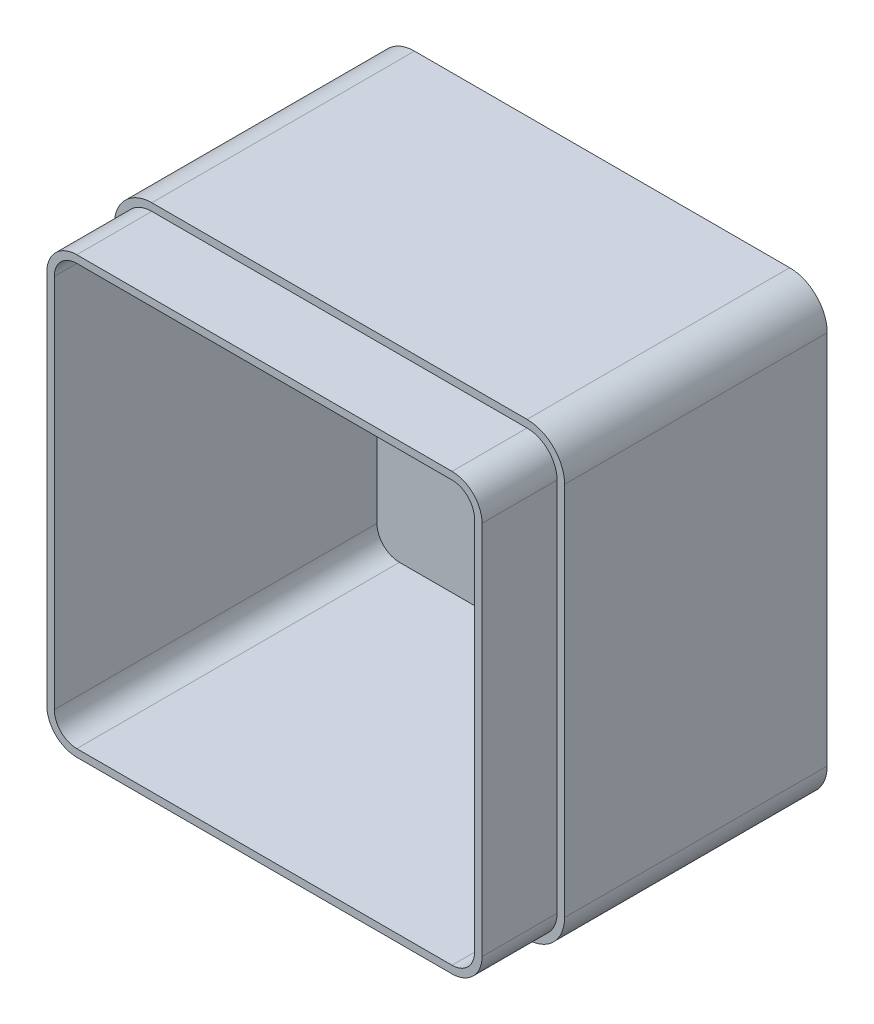
ISO-10303-21;
HEADER;
FILE_DESCRIPTION(('STEP AP214'),'2;1');
FILE_NAME('part.step','',(''),(''),'','','');
FILE_SCHEMA(('AUTOMOTIVE_DESIGN { 1 0 10303 214 1 1 1 1 }'));
ENDSEC;
DATA;
#1=APPLICATION_CONTEXT('core data for automotive mechanical design processes');
#2=APPLICATION_PROTOCOL_DEFINITION('international standard','automotive_design',2000,#1);
#3=PRODUCT_CONTEXT('',#1,'mechanical');
#4=PRODUCT('Part','Part','',(#3));
#5=PRODUCT_RELATED_PRODUCT_CATEGORY('part','',(#4));
#6=PRODUCT_DEFINITION_FORMATION('','',#4);
#7=PRODUCT_DEFINITION_CONTEXT('part definition',#1,'design');
#8=PRODUCT_DEFINITION('design','',#6,#7);
#9=PRODUCT_DEFINITION_SHAPE('','',#8);
#10=(LENGTH_UNIT() NAMED_UNIT(*) SI_UNIT(.MILLI.,.METRE.));
#11=(NAMED_UNIT(*) PLANE_ANGLE_UNIT() SI_UNIT($,.RADIAN.));
#12=(NAMED_UNIT(*) SI_UNIT($,.STERADIAN.) SOLID_ANGLE_UNIT());
#13=UNCERTAINTY_MEASURE_WITH_UNIT(LENGTH_MEASURE(1.E-05),#10,'distance_accuracy_value','');
#14=(GEOMETRIC_REPRESENTATION_CONTEXT(3) GLOBAL_UNCERTAINTY_ASSIGNED_CONTEXT((#13)) GLOBAL_UNIT_ASSIGNED_CONTEXT((#10,
#11,#12)) REPRESENTATION_CONTEXT('',''));
#15=CARTESIAN_POINT('',(0.,0.,0.));
#16=DIRECTION('',(0.,0.,1.));
#17=DIRECTION('',(1.,0.,0.));
#18=AXIS2_PLACEMENT_3D('',#15,#16,#17);
#19=CARTESIAN_POINT('',(0.,0.,90.));
#20=DIRECTION('',(0.,0.,-1.));
#21=DIRECTION('',(-1.,0.,0.));
#22=AXIS2_PLACEMENT_3D('',#19,#20,#21);
#23=PLANE('',#22);
#24=DIRECTION('',(0.,1.,0.));
#25=VECTOR('',#24,1.);
#26=CARTESIAN_POINT('',(116.,0.,90.));
#27=LINE('',#26,#25);
#28=CARTESIAN_POINT('',(116.,9.99999999999999,90.));
#29=VERTEX_POINT('',#28);
#30=CARTESIAN_POINT('',(116.,110.,90.));
#31=VERTEX_POINT('',#30);
#32=EDGE_CURVE('E334',#29,#31,#27,.T.);
#33=ORIENTED_EDGE('',*,*,#32,.F.);
#34=CARTESIAN_POINT('',(110.,10.,90.));
#35=DIRECTION('',(0.,0.,-1.));
#36=DIRECTION('',(-1.,0.,0.));
#37=AXIS2_PLACEMENT_3D('',#34,#35,#36);
#38=CIRCLE('',#37,6.);
#39=CARTESIAN_POINT('',(110.,4.,90.));
#40=VERTEX_POINT('',#39);
#41=EDGE_CURVE('E332',#40,#29,#38,.F.);
#42=ORIENTED_EDGE('',*,*,#41,.F.);
#43=DIRECTION('',(1.,0.,0.));
#44=VECTOR('',#43,1.);
#45=CARTESIAN_POINT('',(0.,4.,90.));
#46=LINE('',#45,#44);
#47=CARTESIAN_POINT('',(9.99999999999999,4.,90.));
#48=VERTEX_POINT('',#47);
#49=EDGE_CURVE('E330',#48,#40,#46,.T.);
#50=ORIENTED_EDGE('',*,*,#49,.F.);
#51=CARTESIAN_POINT('',(10.,10.,90.));
#52=DIRECTION('',(0.,0.,-1.));
#53=DIRECTION('',(-1.,0.,0.));
#54=AXIS2_PLACEMENT_3D('',#51,#52,#53);
#55=CIRCLE('',#54,6.);
#56=CARTESIAN_POINT('',(4.,9.99999999999999,90.));
#57=VERTEX_POINT('',#56);
#58=EDGE_CURVE('E322',#57,#48,#55,.F.);
#59=ORIENTED_EDGE('',*,*,#58,.F.);
#60=DIRECTION('',(0.,-1.,0.));
#61=VECTOR('',#60,1.);
#62=CARTESIAN_POINT('',(4.,0.,90.));
#63=LINE('',#62,#61);
#64=CARTESIAN_POINT('',(4.,110.,90.));
#65=VERTEX_POINT('',#64);
#66=EDGE_CURVE('E296',#65,#57,#63,.T.);
#67=ORIENTED_EDGE('',*,*,#66,.F.);
#68=CARTESIAN_POINT('',(10.,110.,90.));
#69=DIRECTION('',(0.,0.,-1.));
#70=DIRECTION('',(-1.,0.,0.));
#71=AXIS2_PLACEMENT_3D('',#68,#69,#70);
#72=CIRCLE('',#71,6.);
#73=CARTESIAN_POINT('',(9.99999999999999,116.,90.));
#74=VERTEX_POINT('',#73);
#75=EDGE_CURVE('E336',#74,#65,#72,.F.);
#76=ORIENTED_EDGE('',*,*,#75,.F.);
#77=DIRECTION('',(-1.,0.,0.));
#78=VECTOR('',#77,1.);
#79=CARTESIAN_POINT('',(0.,116.,90.));
#80=LINE('',#79,#78);
#81=CARTESIAN_POINT('',(110.,116.,90.));
#82=VERTEX_POINT('',#81);
#83=EDGE_CURVE('E327',#82,#74,#80,.T.);
#84=ORIENTED_EDGE('',*,*,#83,.F.);
#85=CARTESIAN_POINT('',(110.,110.,90.));
#86=DIRECTION('',(0.,0.,-1.));
#87=DIRECTION('',(-1.,0.,0.));
#88=AXIS2_PLACEMENT_3D('',#85,#86,#87);
#89=CIRCLE('',#88,6.);
#90=EDGE_CURVE('E292',#31,#82,#89,.F.);
#91=ORIENTED_EDGE('',*,*,#90,.F.);
#92=EDGE_LOOP('',(#33,#42,#50,#59,#67,#76,#84,#91));
#93=FACE_BOUND('',#92,.T.);
#94=CARTESIAN_POINT('',(10.,110.,90.));
#95=DIRECTION('',(0.,0.,1.));
#96=DIRECTION('',(1.,0.,0.));
#97=AXIS2_PLACEMENT_3D('',#94,#95,#96);
#98=CIRCLE('',#97,7.99999999999999);
#99=CARTESIAN_POINT('',(10.,118.,90.));
#100=VERTEX_POINT('',#99);
#101=CARTESIAN_POINT('',(2.,110.,90.));
#102=VERTEX_POINT('',#101);
#103=EDGE_CURVE('E240',#100,#102,#98,.T.);
#104=ORIENTED_EDGE('',*,*,#103,.T.);
#105=DIRECTION('',(0.,-1.,0.));
#106=VECTOR('',#105,1.);
#107=CARTESIAN_POINT('',(2.,110.,90.));
#108=LINE('',#107,#106);
#109=CARTESIAN_POINT('',(2.,10.,90.));
#110=VERTEX_POINT('',#109);
#111=EDGE_CURVE('E200',#102,#110,#108,.T.);
#112=ORIENTED_EDGE('',*,*,#111,.T.);
#113=CARTESIAN_POINT('',(10.,10.,90.));
#114=DIRECTION('',(0.,0.,1.));
#115=DIRECTION('',(1.,0.,0.));
#116=AXIS2_PLACEMENT_3D('',#113,#114,#115);
#117=CIRCLE('',#116,8.);
#118=CARTESIAN_POINT('',(9.99999999999999,2.,90.));
#119=VERTEX_POINT('',#118);
#120=EDGE_CURVE('E48',#110,#119,#117,.T.);
#121=ORIENTED_EDGE('',*,*,#120,.T.);
#122=DIRECTION('',(1.,0.,0.));
#123=VECTOR('',#122,1.);
#124=CARTESIAN_POINT('',(9.99999999999999,2.,90.));
#125=LINE('',#124,#123);
#126=CARTESIAN_POINT('',(110.,2.,90.));
#127=VERTEX_POINT('',#126);
#128=EDGE_CURVE('E244',#119,#127,#125,.T.);
#129=ORIENTED_EDGE('',*,*,#128,.T.);
#130=CARTESIAN_POINT('',(110.,10.,90.));
#131=DIRECTION('',(0.,0.,1.));
#132=DIRECTION('',(1.,0.,0.));
#133=AXIS2_PLACEMENT_3D('',#130,#131,#132);
#134=CIRCLE('',#133,7.99999999999999);
#135=CARTESIAN_POINT('',(118.,9.99999999999999,90.));
#136=VERTEX_POINT('',#135);
#137=EDGE_CURVE('E247',#127,#136,#134,.T.);
#138=ORIENTED_EDGE('',*,*,#137,.T.);
#139=DIRECTION('',(0.,1.,0.));
#140=VECTOR('',#139,1.);
#141=CARTESIAN_POINT('',(118.,9.99999999999999,90.));
#142=LINE('',#141,#140);
#143=CARTESIAN_POINT('',(118.,110.,90.));
#144=VERTEX_POINT('',#143);
#145=EDGE_CURVE('E250',#136,#144,#142,.T.);
#146=ORIENTED_EDGE('',*,*,#145,.T.);
#147=CARTESIAN_POINT('',(110.,110.,90.));
#148=DIRECTION('',(0.,0.,1.));
#149=DIRECTION('',(1.,0.,0.));
#150=AXIS2_PLACEMENT_3D('',#147,#148,#149);
#151=CIRCLE('',#150,7.99999999999999);
#152=CARTESIAN_POINT('',(110.,118.,90.));
#153=VERTEX_POINT('',#152);
#154=EDGE_CURVE('E223',#144,#153,#151,.T.);
#155=ORIENTED_EDGE('',*,*,#154,.T.);
#156=DIRECTION('',(-1.,0.,0.));
#157=VECTOR('',#156,1.);
#158=CARTESIAN_POINT('',(110.,118.,90.));
#159=LINE('',#158,#157);
#160=EDGE_CURVE('E220',#153,#100,#159,.T.);
#161=ORIENTED_EDGE('',*,*,#160,.T.);
#162=EDGE_LOOP('',(#104,#112,#121,#129,#138,#146,#155,#161));
#163=FACE_BOUND('',#162,.T.);
#164=ADVANCED_FACE('F33',(#93,#163),#23,.F.);
#165=CARTESIAN_POINT('',(4.,0.,90.));
#166=DIRECTION('',(1.,0.,0.));
#167=DIRECTION('',(0.,0.,-1.));
#168=AXIS2_PLACEMENT_3D('',#165,#166,#167);
#169=PLANE('',#168);
#170=ORIENTED_EDGE('',*,*,#66,.T.);
#171=DIRECTION('',(0.,0.,-1.));
#172=VECTOR('',#171,1.);
#173=CARTESIAN_POINT('',(4.,9.99999999999999,90.));
#174=LINE('',#173,#172);
#175=CARTESIAN_POINT('',(4.,9.99999999999999,4.));
#176=VERTEX_POINT('',#175);
#177=EDGE_CURVE('E287',#176,#57,#174,.F.);
#178=ORIENTED_EDGE('',*,*,#177,.F.);
#179=DIRECTION('',(0.,-1.,0.));
#180=VECTOR('',#179,1.);
#181=CARTESIAN_POINT('',(4.,0.,4.));
#182=LINE('',#181,#180);
#183=CARTESIAN_POINT('',(4.,110.,4.));
#184=VERTEX_POINT('',#183);
#185=EDGE_CURVE('E282',#184,#176,#182,.T.);
#186=ORIENTED_EDGE('',*,*,#185,.F.);
#187=DIRECTION('',(0.,0.,-1.));
#188=VECTOR('',#187,1.);
#189=CARTESIAN_POINT('',(4.,110.,90.));
#190=LINE('',#189,#188);
#191=EDGE_CURVE('E283',#65,#184,#190,.T.);
#192=ORIENTED_EDGE('',*,*,#191,.F.);
#193=EDGE_LOOP('',(#170,#178,#186,#192));
#194=FACE_BOUND('',#193,.T.);
#195=ADVANCED_FACE('F423',(#194),#169,.T.);
#196=CARTESIAN_POINT('',(0.,4.,90.));
#197=DIRECTION('',(0.,1.,0.));
#198=DIRECTION('',(0.,0.,1.));
#199=AXIS2_PLACEMENT_3D('',#196,#197,#198);
#200=PLANE('',#199);
#201=DIRECTION('',(1.,0.,0.));
#202=VECTOR('',#201,1.);
#203=CARTESIAN_POINT('',(0.,4.,4.));
#204=LINE('',#203,#202);
#205=CARTESIAN_POINT('',(9.99999999999999,4.,4.));
#206=VERTEX_POINT('',#205);
#207=CARTESIAN_POINT('',(110.,4.,4.));
#208=VERTEX_POINT('',#207);
#209=EDGE_CURVE('E290',#206,#208,#204,.T.);
#210=ORIENTED_EDGE('',*,*,#209,.F.);
#211=DIRECTION('',(0.,0.,1.));
#212=VECTOR('',#211,1.);
#213=CARTESIAN_POINT('',(9.99999999999999,4.,90.));
#214=LINE('',#213,#212);
#215=EDGE_CURVE('E286',#48,#206,#214,.F.);
#216=ORIENTED_EDGE('',*,*,#215,.F.);
#217=ORIENTED_EDGE('',*,*,#49,.T.);
#218=DIRECTION('',(0.,0.,1.));
#219=VECTOR('',#218,1.);
#220=CARTESIAN_POINT('',(110.,4.,90.));
#221=LINE('',#220,#219);
#222=EDGE_CURVE('E312',#208,#40,#221,.T.);
#223=ORIENTED_EDGE('',*,*,#222,.F.);
#224=EDGE_LOOP('',(#210,#216,#217,#223));
#225=FACE_BOUND('',#224,.T.);
#226=ADVANCED_FACE('F429',(#225),#200,.T.);
#227=CARTESIAN_POINT('',(116.,0.,90.));
#228=DIRECTION('',(-1.,0.,0.));
#229=DIRECTION('',(0.,0.,1.));
#230=AXIS2_PLACEMENT_3D('',#227,#228,#229);
#231=PLANE('',#230);
#232=DIRECTION('',(0.,1.,0.));
#233=VECTOR('',#232,1.);
#234=CARTESIAN_POINT('',(116.,0.,4.));
#235=LINE('',#234,#233);
#236=CARTESIAN_POINT('',(116.,9.99999999999999,4.));
#237=VERTEX_POINT('',#236);
#238=CARTESIAN_POINT('',(116.,110.,4.));
#239=VERTEX_POINT('',#238);
#240=EDGE_CURVE('E297',#237,#239,#235,.T.);
#241=ORIENTED_EDGE('',*,*,#240,.F.);
#242=DIRECTION('',(0.,0.,1.));
#243=VECTOR('',#242,1.);
#244=CARTESIAN_POINT('',(116.,9.99999999999999,90.));
#245=LINE('',#244,#243);
#246=EDGE_CURVE('E300',#29,#237,#245,.F.);
#247=ORIENTED_EDGE('',*,*,#246,.F.);
#248=ORIENTED_EDGE('',*,*,#32,.T.);
#249=DIRECTION('',(0.,0.,1.));
#250=VECTOR('',#249,1.);
#251=CARTESIAN_POINT('',(116.,110.,90.));
#252=LINE('',#251,#250);
#253=EDGE_CURVE('E320',#239,#31,#252,.T.);
#254=ORIENTED_EDGE('',*,*,#253,.F.);
#255=EDGE_LOOP('',(#241,#247,#248,#254));
#256=FACE_BOUND('',#255,.T.);
#257=ADVANCED_FACE('F593',(#256),#231,.T.);
#258=CARTESIAN_POINT('',(0.,116.,90.));
#259=DIRECTION('',(0.,-1.,0.));
#260=DIRECTION('',(0.,0.,-1.));
#261=AXIS2_PLACEMENT_3D('',#258,#259,#260);
#262=PLANE('',#261);
#263=ORIENTED_EDGE('',*,*,#83,.T.);
#264=DIRECTION('',(0.,0.,-1.));
#265=VECTOR('',#264,1.);
#266=CARTESIAN_POINT('',(9.99999999999999,116.,90.));
#267=LINE('',#266,#265);
#268=CARTESIAN_POINT('',(9.99999999999999,116.,4.));
#269=VERTEX_POINT('',#268);
#270=EDGE_CURVE('E325',#269,#74,#267,.F.);
#271=ORIENTED_EDGE('',*,*,#270,.F.);
#272=DIRECTION('',(-1.,0.,0.));
#273=VECTOR('',#272,1.);
#274=CARTESIAN_POINT('',(0.,116.,4.));
#275=LINE('',#274,#273);
#276=CARTESIAN_POINT('',(110.,116.,4.));
#277=VERTEX_POINT('',#276);
#278=EDGE_CURVE('E293',#277,#269,#275,.T.);
#279=ORIENTED_EDGE('',*,*,#278,.F.);
#280=DIRECTION('',(0.,0.,-1.));
#281=VECTOR('',#280,1.);
#282=CARTESIAN_POINT('',(110.,116.,90.));
#283=LINE('',#282,#281);
#284=EDGE_CURVE('E310',#82,#277,#283,.T.);
#285=ORIENTED_EDGE('',*,*,#284,.F.);
#286=EDGE_LOOP('',(#263,#271,#279,#285));
#287=FACE_BOUND('',#286,.T.);
#288=ADVANCED_FACE('F603',(#287),#262,.T.);
#289=CARTESIAN_POINT('',(0.,0.,4.));
#290=DIRECTION('',(0.,0.,-1.));
#291=DIRECTION('',(-1.,0.,0.));
#292=AXIS2_PLACEMENT_3D('',#289,#290,#291);
#293=PLANE('',#292);
#294=ORIENTED_EDGE('',*,*,#278,.T.);
#295=CARTESIAN_POINT('',(10.,110.,4.));
#296=DIRECTION('',(0.,0.,-1.));
#297=DIRECTION('',(-1.,0.,0.));
#298=AXIS2_PLACEMENT_3D('',#295,#296,#297);
#299=CIRCLE('',#298,6.);
#300=EDGE_CURVE('E301',#184,#269,#299,.T.);
#301=ORIENTED_EDGE('',*,*,#300,.F.);
#302=ORIENTED_EDGE('',*,*,#185,.T.);
#303=CARTESIAN_POINT('',(10.,10.,4.));
#304=DIRECTION('',(0.,0.,-1.));
#305=DIRECTION('',(-1.,0.,0.));
#306=AXIS2_PLACEMENT_3D('',#303,#304,#305);
#307=CIRCLE('',#306,6.);
#308=EDGE_CURVE('E306',#206,#176,#307,.T.);
#309=ORIENTED_EDGE('',*,*,#308,.F.);
#310=ORIENTED_EDGE('',*,*,#209,.T.);
#311=CARTESIAN_POINT('',(110.,10.,4.));
#312=DIRECTION('',(0.,0.,-1.));
#313=DIRECTION('',(-1.,0.,0.));
#314=AXIS2_PLACEMENT_3D('',#311,#312,#313);
#315=CIRCLE('',#314,6.);
#316=EDGE_CURVE('E304',#237,#208,#315,.T.);
#317=ORIENTED_EDGE('',*,*,#316,.F.);
#318=ORIENTED_EDGE('',*,*,#240,.T.);
#319=CARTESIAN_POINT('',(110.,110.,4.));
#320=DIRECTION('',(0.,0.,-1.));
#321=DIRECTION('',(-1.,0.,0.));
#322=AXIS2_PLACEMENT_3D('',#319,#320,#321);
#323=CIRCLE('',#322,6.);
#324=EDGE_CURVE('E298',#277,#239,#323,.T.);
#325=ORIENTED_EDGE('',*,*,#324,.F.);
#326=EDGE_LOOP('',(#294,#301,#302,#309,#310,#317,#318,#325));
#327=FACE_BOUND('',#326,.T.);
#328=ADVANCED_FACE('F613',(#327),#293,.F.);
#329=CARTESIAN_POINT('',(110.,110.,90.));
#330=DIRECTION('',(0.,0.,-1.));
#331=DIRECTION('',(-1.,0.,0.));
#332=AXIS2_PLACEMENT_3D('',#329,#330,#331);
#333=CYLINDRICAL_SURFACE('',#332,6.);
#334=ORIENTED_EDGE('',*,*,#90,.T.);
#335=ORIENTED_EDGE('',*,*,#284,.T.);
#336=ORIENTED_EDGE('',*,*,#324,.T.);
#337=ORIENTED_EDGE('',*,*,#253,.T.);
#338=EDGE_LOOP('',(#334,#335,#336,#337));
#339=FACE_BOUND('',#338,.T.);
#340=ADVANCED_FACE('F623',(#339),#333,.F.);
#341=CARTESIAN_POINT('',(10.,110.,90.));
#342=DIRECTION('',(0.,0.,-1.));
#343=DIRECTION('',(-1.,0.,0.));
#344=AXIS2_PLACEMENT_3D('',#341,#342,#343);
#345=CYLINDRICAL_SURFACE('',#344,6.);
#346=ORIENTED_EDGE('',*,*,#75,.T.);
#347=ORIENTED_EDGE('',*,*,#191,.T.);
#348=ORIENTED_EDGE('',*,*,#300,.T.);
#349=ORIENTED_EDGE('',*,*,#270,.T.);
#350=EDGE_LOOP('',(#346,#347,#348,#349));
#351=FACE_BOUND('',#350,.T.);
#352=ADVANCED_FACE('F633',(#351),#345,.F.);
#353=CARTESIAN_POINT('',(110.,10.,90.));
#354=DIRECTION('',(0.,0.,-1.));
#355=DIRECTION('',(-1.,0.,0.));
#356=AXIS2_PLACEMENT_3D('',#353,#354,#355);
#357=CYLINDRICAL_SURFACE('',#356,6.);
#358=ORIENTED_EDGE('',*,*,#41,.T.);
#359=ORIENTED_EDGE('',*,*,#246,.T.);
#360=ORIENTED_EDGE('',*,*,#316,.T.);
#361=ORIENTED_EDGE('',*,*,#222,.T.);
#362=EDGE_LOOP('',(#358,#359,#360,#361));
#363=FACE_BOUND('',#362,.T.);
#364=ADVANCED_FACE('F643',(#363),#357,.F.);
#365=CARTESIAN_POINT('',(10.,10.,90.));
#366=DIRECTION('',(0.,0.,-1.));
#367=DIRECTION('',(-1.,0.,0.));
#368=AXIS2_PLACEMENT_3D('',#365,#366,#367);
#369=CYLINDRICAL_SURFACE('',#368,6.);
#370=ORIENTED_EDGE('',*,*,#58,.T.);
#371=ORIENTED_EDGE('',*,*,#215,.T.);
#372=ORIENTED_EDGE('',*,*,#308,.T.);
#373=ORIENTED_EDGE('',*,*,#177,.T.);
#374=EDGE_LOOP('',(#370,#371,#372,#373));
#375=FACE_BOUND('',#374,.T.);
#376=ADVANCED_FACE('F436',(#375),#369,.F.);
#377=CARTESIAN_POINT('',(110.,10.,70.));
#378=DIRECTION('',(0.,0.,1.));
#379=DIRECTION('',(1.,0.,0.));
#380=AXIS2_PLACEMENT_3D('',#377,#378,#379);
#381=PLANE('',#380);
#382=DIRECTION('',(-1.,0.,0.));
#383=VECTOR('',#382,1.);
#384=CARTESIAN_POINT('',(110.,118.,70.));
#385=LINE('',#384,#383);
#386=CARTESIAN_POINT('',(110.,118.,70.));
#387=VERTEX_POINT('',#386);
#388=CARTESIAN_POINT('',(10.,118.,70.));
#389=VERTEX_POINT('',#388);
#390=EDGE_CURVE('E206',#387,#389,#385,.T.);
#391=ORIENTED_EDGE('',*,*,#390,.F.);
#392=CARTESIAN_POINT('',(110.,110.,70.));
#393=DIRECTION('',(0.,0.,1.));
#394=DIRECTION('',(1.,0.,0.));
#395=AXIS2_PLACEMENT_3D('',#392,#393,#394);
#396=CIRCLE('',#395,7.99999999999999);
#397=CARTESIAN_POINT('',(118.,110.,70.));
#398=VERTEX_POINT('',#397);
#399=EDGE_CURVE('E236',#398,#387,#396,.T.);
#400=ORIENTED_EDGE('',*,*,#399,.F.);
#401=DIRECTION('',(0.,1.,0.));
#402=VECTOR('',#401,1.);
#403=CARTESIAN_POINT('',(118.,9.99999999999999,70.));
#404=LINE('',#403,#402);
#405=CARTESIAN_POINT('',(118.,9.99999999999999,70.));
#406=VERTEX_POINT('',#405);
#407=EDGE_CURVE('E233',#406,#398,#404,.T.);
#408=ORIENTED_EDGE('',*,*,#407,.F.);
#409=CARTESIAN_POINT('',(110.,10.,70.));
#410=DIRECTION('',(0.,0.,1.));
#411=DIRECTION('',(1.,0.,0.));
#412=AXIS2_PLACEMENT_3D('',#409,#410,#411);
#413=CIRCLE('',#412,7.99999999999999);
#414=CARTESIAN_POINT('',(110.,2.,70.));
#415=VERTEX_POINT('',#414);
#416=EDGE_CURVE('E230',#415,#406,#413,.T.);
#417=ORIENTED_EDGE('',*,*,#416,.F.);
#418=DIRECTION('',(1.,0.,0.));
#419=VECTOR('',#418,1.);
#420=CARTESIAN_POINT('',(9.99999999999999,2.,70.));
#421=LINE('',#420,#419);
#422=CARTESIAN_POINT('',(9.99999999999999,2.,70.));
#423=VERTEX_POINT('',#422);
#424=EDGE_CURVE('E227',#423,#415,#421,.T.);
#425=ORIENTED_EDGE('',*,*,#424,.F.);
#426=CARTESIAN_POINT('',(10.,10.,70.));
#427=DIRECTION('',(0.,0.,1.));
#428=DIRECTION('',(1.,0.,0.));
#429=AXIS2_PLACEMENT_3D('',#426,#427,#428);
#430=CIRCLE('',#429,8.);
#431=CARTESIAN_POINT('',(2.,10.,70.));
#432=VERTEX_POINT('',#431);
#433=EDGE_CURVE('E216',#432,#423,#430,.T.);
#434=ORIENTED_EDGE('',*,*,#433,.F.);
#435=DIRECTION('',(0.,-1.,0.));
#436=VECTOR('',#435,1.);
#437=CARTESIAN_POINT('',(2.,110.,70.));
#438=LINE('',#437,#436);
#439=CARTESIAN_POINT('',(2.,110.,70.));
#440=VERTEX_POINT('',#439);
#441=EDGE_CURVE('E198',#440,#432,#438,.T.);
#442=ORIENTED_EDGE('',*,*,#441,.F.);
#443=CARTESIAN_POINT('',(10.,110.,70.));
#444=DIRECTION('',(0.,0.,1.));
#445=DIRECTION('',(1.,0.,0.));
#446=AXIS2_PLACEMENT_3D('',#443,#444,#445);
#447=CIRCLE('',#446,7.99999999999999);
#448=EDGE_CURVE('E212',#389,#440,#447,.T.);
#449=ORIENTED_EDGE('',*,*,#448,.F.);
#450=EDGE_LOOP('',(#391,#400,#408,#417,#425,#434,#442,#449));
#451=FACE_BOUND('',#450,.T.);
#452=CARTESIAN_POINT('',(110.,10.,70.));
#453=DIRECTION('',(0.,0.,1.));
#454=DIRECTION('',(1.,0.,0.));
#455=AXIS2_PLACEMENT_3D('',#452,#453,#454);
#456=CIRCLE('',#455,9.99999999999999);
#457=CARTESIAN_POINT('',(110.,0.,70.));
#458=VERTEX_POINT('',#457);
#459=CARTESIAN_POINT('',(120.,10.,70.));
#460=VERTEX_POINT('',#459);
#461=EDGE_CURVE('E256',#458,#460,#456,.T.);
#462=ORIENTED_EDGE('',*,*,#461,.T.);
#463=DIRECTION('',(0.,1.,0.));
#464=VECTOR('',#463,1.);
#465=CARTESIAN_POINT('',(120.,10.,70.));
#466=LINE('',#465,#464);
#467=CARTESIAN_POINT('',(120.,110.,70.));
#468=VERTEX_POINT('',#467);
#469=EDGE_CURVE('E269',#460,#468,#466,.T.);
#470=ORIENTED_EDGE('',*,*,#469,.T.);
#471=CARTESIAN_POINT('',(110.,110.,70.));
#472=DIRECTION('',(0.,0.,1.));
#473=DIRECTION('',(1.,0.,0.));
#474=AXIS2_PLACEMENT_3D('',#471,#472,#473);
#475=CIRCLE('',#474,9.99999999999999);
#476=CARTESIAN_POINT('',(110.,120.,70.));
#477=VERTEX_POINT('',#476);
#478=EDGE_CURVE('E271',#468,#477,#475,.T.);
#479=ORIENTED_EDGE('',*,*,#478,.T.);
#480=DIRECTION('',(-1.,0.,0.));
#481=VECTOR('',#480,1.);
#482=CARTESIAN_POINT('',(110.,120.,70.));
#483=LINE('',#482,#481);
#484=CARTESIAN_POINT('',(10.,120.,70.));
#485=VERTEX_POINT('',#484);
#486=EDGE_CURVE('E273',#477,#485,#483,.T.);
#487=ORIENTED_EDGE('',*,*,#486,.T.);
#488=CARTESIAN_POINT('',(10.,110.,70.));
#489=DIRECTION('',(0.,0.,1.));
#490=DIRECTION('',(1.,0.,0.));
#491=AXIS2_PLACEMENT_3D('',#488,#489,#490);
#492=CIRCLE('',#491,9.99999999999999);
#493=CARTESIAN_POINT('',(0.,110.,70.));
#494=VERTEX_POINT('',#493);
#495=EDGE_CURVE('E275',#485,#494,#492,.T.);
#496=ORIENTED_EDGE('',*,*,#495,.T.);
#497=DIRECTION('',(0.,-1.,0.));
#498=VECTOR('',#497,1.);
#499=CARTESIAN_POINT('',(0.,110.,70.));
#500=LINE('',#499,#498);
#501=CARTESIAN_POINT('',(0.,10.,70.));
#502=VERTEX_POINT('',#501);
#503=EDGE_CURVE('E56',#494,#502,#500,.T.);
#504=ORIENTED_EDGE('',*,*,#503,.T.);
#505=CARTESIAN_POINT('',(10.,10.,70.));
#506=DIRECTION('',(0.,0.,1.));
#507=DIRECTION('',(1.,0.,0.));
#508=AXIS2_PLACEMENT_3D('',#505,#506,#507);
#509=CIRCLE('',#508,10.);
#510=CARTESIAN_POINT('',(9.99999999999999,0.,70.));
#511=VERTEX_POINT('',#510);
#512=EDGE_CURVE('E278',#502,#511,#509,.T.);
#513=ORIENTED_EDGE('',*,*,#512,.T.);
#514=DIRECTION('',(1.,0.,0.));
#515=VECTOR('',#514,1.);
#516=CARTESIAN_POINT('',(9.99999999999999,0.,70.));
#517=LINE('',#516,#515);
#518=EDGE_CURVE('E280',#511,#458,#517,.T.);
#519=ORIENTED_EDGE('',*,*,#518,.T.);
#520=EDGE_LOOP('',(#462,#470,#479,#487,#496,#504,#513,#519));
#521=FACE_BOUND('',#520,.T.);
#522=ADVANCED_FACE('F211',(#451,#521),#381,.T.);
#523=CARTESIAN_POINT('',(10.,110.,70.));
#524=DIRECTION('',(0.,0.,1.));
#525=DIRECTION('',(1.,0.,0.));
#526=AXIS2_PLACEMENT_3D('',#523,#524,#525);
#527=CYLINDRICAL_SURFACE('',#526,7.99999999999999);
#528=ORIENTED_EDGE('',*,*,#103,.F.);
#529=DIRECTION('',(0.,0.,1.));
#530=VECTOR('',#529,1.);
#531=CARTESIAN_POINT('',(10.,118.,70.));
#532=LINE('',#531,#530);
#533=EDGE_CURVE('E219',#389,#100,#532,.T.);
#534=ORIENTED_EDGE('',*,*,#533,.F.);
#535=ORIENTED_EDGE('',*,*,#448,.T.);
#536=DIRECTION('',(0.,0.,1.));
#537=VECTOR('',#536,1.);
#538=CARTESIAN_POINT('',(2.,110.,70.));
#539=LINE('',#538,#537);
#540=EDGE_CURVE('E195',#440,#102,#539,.T.);
#541=ORIENTED_EDGE('',*,*,#540,.T.);
#542=EDGE_LOOP('',(#528,#534,#535,#541));
#543=FACE_BOUND('',#542,.T.);
#544=ADVANCED_FACE('F218',(#543),#527,.T.);
#545=CARTESIAN_POINT('',(110.,118.,70.));
#546=DIRECTION('',(0.,1.,0.));
#547=DIRECTION('',(0.,0.,1.));
#548=AXIS2_PLACEMENT_3D('',#545,#546,#547);
#549=PLANE('',#548);
#550=ORIENTED_EDGE('',*,*,#160,.F.);
#551=DIRECTION('',(0.,0.,1.));
#552=VECTOR('',#551,1.);
#553=CARTESIAN_POINT('',(110.,118.,70.));
#554=LINE('',#553,#552);
#555=EDGE_CURVE('E257',#387,#153,#554,.T.);
#556=ORIENTED_EDGE('',*,*,#555,.F.);
#557=ORIENTED_EDGE('',*,*,#390,.T.);
#558=ORIENTED_EDGE('',*,*,#533,.T.);
#559=EDGE_LOOP('',(#550,#556,#557,#558));
#560=FACE_BOUND('',#559,.T.);
#561=ADVANCED_FACE('F508',(#560),#549,.T.);
#562=CARTESIAN_POINT('',(110.,110.,70.));
#563=DIRECTION('',(0.,0.,1.));
#564=DIRECTION('',(1.,0.,0.));
#565=AXIS2_PLACEMENT_3D('',#562,#563,#564);
#566=CYLINDRICAL_SURFACE('',#565,7.99999999999999);
#567=ORIENTED_EDGE('',*,*,#154,.F.);
#568=DIRECTION('',(0.,0.,1.));
#569=VECTOR('',#568,1.);
#570=CARTESIAN_POINT('',(118.,110.,70.));
#571=LINE('',#570,#569);
#572=EDGE_CURVE('E259',#398,#144,#571,.T.);
#573=ORIENTED_EDGE('',*,*,#572,.F.);
#574=ORIENTED_EDGE('',*,*,#399,.T.);
#575=ORIENTED_EDGE('',*,*,#555,.T.);
#576=EDGE_LOOP('',(#567,#573,#574,#575));
#577=FACE_BOUND('',#576,.T.);
#578=ADVANCED_FACE('F516',(#577),#566,.T.);
#579=CARTESIAN_POINT('',(118.,9.99999999999999,70.));
#580=DIRECTION('',(1.,0.,0.));
#581=DIRECTION('',(0.,0.,-1.));
#582=AXIS2_PLACEMENT_3D('',#579,#580,#581);
#583=PLANE('',#582);
#584=ORIENTED_EDGE('',*,*,#145,.F.);
#585=DIRECTION('',(0.,0.,1.));
#586=VECTOR('',#585,1.);
#587=CARTESIAN_POINT('',(118.,9.99999999999999,70.));
#588=LINE('',#587,#586);
#589=EDGE_CURVE('E261',#406,#136,#588,.T.);
#590=ORIENTED_EDGE('',*,*,#589,.F.);
#591=ORIENTED_EDGE('',*,*,#407,.T.);
#592=ORIENTED_EDGE('',*,*,#572,.T.);
#593=EDGE_LOOP('',(#584,#590,#591,#592));
#594=FACE_BOUND('',#593,.T.);
#595=ADVANCED_FACE('F525',(#594),#583,.T.);
#596=CARTESIAN_POINT('',(110.,10.,70.));
#597=DIRECTION('',(0.,0.,1.));
#598=DIRECTION('',(1.,0.,0.));
#599=AXIS2_PLACEMENT_3D('',#596,#597,#598);
#600=CYLINDRICAL_SURFACE('',#599,7.99999999999999);
#601=ORIENTED_EDGE('',*,*,#137,.F.);
#602=DIRECTION('',(0.,0.,1.));
#603=VECTOR('',#602,1.);
#604=CARTESIAN_POINT('',(110.,2.,70.));
#605=LINE('',#604,#603);
#606=EDGE_CURVE('E263',#415,#127,#605,.T.);
#607=ORIENTED_EDGE('',*,*,#606,.F.);
#608=ORIENTED_EDGE('',*,*,#416,.T.);
#609=ORIENTED_EDGE('',*,*,#589,.T.);
#610=EDGE_LOOP('',(#601,#607,#608,#609));
#611=FACE_BOUND('',#610,.T.);
#612=ADVANCED_FACE('F534',(#611),#600,.T.);
#613=CARTESIAN_POINT('',(9.99999999999999,2.,70.));
#614=DIRECTION('',(0.,-1.,0.));
#615=DIRECTION('',(0.,0.,-1.));
#616=AXIS2_PLACEMENT_3D('',#613,#614,#615);
#617=PLANE('',#616);
#618=ORIENTED_EDGE('',*,*,#128,.F.);
#619=DIRECTION('',(0.,0.,1.));
#620=VECTOR('',#619,1.);
#621=CARTESIAN_POINT('',(9.99999999999999,2.,70.));
#622=LINE('',#621,#620);
#623=EDGE_CURVE('E265',#423,#119,#622,.T.);
#624=ORIENTED_EDGE('',*,*,#623,.F.);
#625=ORIENTED_EDGE('',*,*,#424,.T.);
#626=ORIENTED_EDGE('',*,*,#606,.T.);
#627=EDGE_LOOP('',(#618,#624,#625,#626));
#628=FACE_BOUND('',#627,.T.);
#629=ADVANCED_FACE('F543',(#628),#617,.T.);
#630=CARTESIAN_POINT('',(10.,10.,70.));
#631=DIRECTION('',(0.,0.,1.));
#632=DIRECTION('',(1.,0.,0.));
#633=AXIS2_PLACEMENT_3D('',#630,#631,#632);
#634=CYLINDRICAL_SURFACE('',#633,8.);
#635=ORIENTED_EDGE('',*,*,#120,.F.);
#636=DIRECTION('',(0.,0.,1.));
#637=VECTOR('',#636,1.);
#638=CARTESIAN_POINT('',(2.,10.,70.));
#639=LINE('',#638,#637);
#640=EDGE_CURVE('E205',#432,#110,#639,.T.);
#641=ORIENTED_EDGE('',*,*,#640,.F.);
#642=ORIENTED_EDGE('',*,*,#433,.T.);
#643=ORIENTED_EDGE('',*,*,#623,.T.);
#644=EDGE_LOOP('',(#635,#641,#642,#643));
#645=FACE_BOUND('',#644,.T.);
#646=ADVANCED_FACE('F552',(#645),#634,.T.);
#647=CARTESIAN_POINT('',(2.,110.,70.));
#648=DIRECTION('',(-1.,0.,0.));
#649=DIRECTION('',(0.,-1.,0.));
#650=AXIS2_PLACEMENT_3D('',#647,#648,#649);
#651=PLANE('',#650);
#652=ORIENTED_EDGE('',*,*,#111,.F.);
#653=ORIENTED_EDGE('',*,*,#540,.F.);
#654=ORIENTED_EDGE('',*,*,#441,.T.);
#655=ORIENTED_EDGE('',*,*,#640,.T.);
#656=EDGE_LOOP('',(#652,#653,#654,#655));
#657=FACE_BOUND('',#656,.T.);
#658=ADVANCED_FACE('F197',(#657),#651,.T.);
#659=CARTESIAN_POINT('',(0.,0.,0.));
#660=DIRECTION('',(0.,0.,-1.));
#661=DIRECTION('',(-1.,0.,0.));
#662=AXIS2_PLACEMENT_3D('',#659,#660,#661);
#663=PLANE('',#662);
#664=DIRECTION('',(-1.,0.,0.));
#665=VECTOR('',#664,1.);
#666=CARTESIAN_POINT('',(0.,120.,0.));
#667=LINE('',#666,#665);
#668=CARTESIAN_POINT('',(110.,120.,0.));
#669=VERTEX_POINT('',#668);
#670=CARTESIAN_POINT('',(10.,120.,0.));
#671=VERTEX_POINT('',#670);
#672=EDGE_CURVE('E351',#669,#671,#667,.T.);
#673=ORIENTED_EDGE('',*,*,#672,.F.);
#674=CARTESIAN_POINT('',(110.,110.,0.));
#675=DIRECTION('',(0.,0.,-1.));
#676=DIRECTION('',(-1.,0.,0.));
#677=AXIS2_PLACEMENT_3D('',#674,#675,#676);
#678=CIRCLE('',#677,10.);
#679=CARTESIAN_POINT('',(120.,110.,0.));
#680=VERTEX_POINT('',#679);
#681=EDGE_CURVE('E365',#669,#680,#678,.T.);
#682=ORIENTED_EDGE('',*,*,#681,.T.);
#683=DIRECTION('',(0.,1.,0.));
#684=VECTOR('',#683,1.);
#685=CARTESIAN_POINT('',(120.,0.,0.));
#686=LINE('',#685,#684);
#687=CARTESIAN_POINT('',(120.,10.,0.));
#688=VERTEX_POINT('',#687);
#689=EDGE_CURVE('E348',#688,#680,#686,.T.);
#690=ORIENTED_EDGE('',*,*,#689,.F.);
#691=CARTESIAN_POINT('',(110.,10.,0.));
#692=DIRECTION('',(0.,0.,-1.));
#693=DIRECTION('',(-1.,0.,0.));
#694=AXIS2_PLACEMENT_3D('',#691,#692,#693);
#695=CIRCLE('',#694,10.);
#696=CARTESIAN_POINT('',(110.,0.,0.));
#697=VERTEX_POINT('',#696);
#698=EDGE_CURVE('E361',#688,#697,#695,.T.);
#699=ORIENTED_EDGE('',*,*,#698,.T.);
#700=DIRECTION('',(1.,0.,0.));
#701=VECTOR('',#700,1.);
#702=CARTESIAN_POINT('',(0.,0.,0.));
#703=LINE('',#702,#701);
#704=CARTESIAN_POINT('',(10.,0.,0.));
#705=VERTEX_POINT('',#704);
#706=EDGE_CURVE('E345',#705,#697,#703,.T.);
#707=ORIENTED_EDGE('',*,*,#706,.F.);
#708=CARTESIAN_POINT('',(10.,10.,0.));
#709=DIRECTION('',(0.,0.,-1.));
#710=DIRECTION('',(-1.,0.,0.));
#711=AXIS2_PLACEMENT_3D('',#708,#709,#710);
#712=CIRCLE('',#711,10.);
#713=CARTESIAN_POINT('',(0.,10.,0.));
#714=VERTEX_POINT('',#713);
#715=EDGE_CURVE('E359',#705,#714,#712,.T.);
#716=ORIENTED_EDGE('',*,*,#715,.T.);
#717=DIRECTION('',(0.,-1.,0.));
#718=VECTOR('',#717,1.);
#719=CARTESIAN_POINT('',(0.,0.,0.));
#720=LINE('',#719,#718);
#721=CARTESIAN_POINT('',(0.,110.,0.));
#722=VERTEX_POINT('',#721);
#723=EDGE_CURVE('E315',#722,#714,#720,.T.);
#724=ORIENTED_EDGE('',*,*,#723,.F.);
#725=CARTESIAN_POINT('',(10.,110.,0.));
#726=DIRECTION('',(0.,0.,-1.));
#727=DIRECTION('',(-1.,0.,0.));
#728=AXIS2_PLACEMENT_3D('',#725,#726,#727);
#729=CIRCLE('',#728,10.);
#730=EDGE_CURVE('E363',#722,#671,#729,.T.);
#731=ORIENTED_EDGE('',*,*,#730,.T.);
#732=EDGE_LOOP('',(#673,#682,#690,#699,#707,#716,#724,#731));
#733=FACE_BOUND('',#732,.T.);
#734=ADVANCED_FACE('F388',(#733),#663,.T.);
#735=CARTESIAN_POINT('',(10.,110.,90.));
#736=DIRECTION('',(0.,0.,-1.));
#737=DIRECTION('',(-1.,0.,0.));
#738=AXIS2_PLACEMENT_3D('',#735,#736,#737);
#739=CYLINDRICAL_SURFACE('',#738,10.);
#740=DIRECTION('',(0.,0.,-1.));
#741=VECTOR('',#740,1.);
#742=CARTESIAN_POINT('',(0.,110.,90.));
#743=LINE('',#742,#741);
#744=EDGE_CURVE('E375',#494,#722,#743,.T.);
#745=ORIENTED_EDGE('',*,*,#744,.F.);
#746=ORIENTED_EDGE('',*,*,#495,.F.);
#747=DIRECTION('',(0.,0.,-1.));
#748=VECTOR('',#747,1.);
#749=CARTESIAN_POINT('',(10.,120.,90.));
#750=LINE('',#749,#748);
#751=EDGE_CURVE('E354',#671,#485,#750,.F.);
#752=ORIENTED_EDGE('',*,*,#751,.F.);
#753=ORIENTED_EDGE('',*,*,#730,.F.);
#754=EDGE_LOOP('',(#745,#746,#752,#753));
#755=FACE_BOUND('',#754,.T.);
#756=ADVANCED_FACE('F412',(#755),#739,.T.);
#757=CARTESIAN_POINT('',(110.,110.,90.));
#758=DIRECTION('',(0.,0.,-1.));
#759=DIRECTION('',(-1.,0.,0.));
#760=AXIS2_PLACEMENT_3D('',#757,#758,#759);
#761=CYLINDRICAL_SURFACE('',#760,10.);
#762=DIRECTION('',(0.,0.,-1.));
#763=VECTOR('',#762,1.);
#764=CARTESIAN_POINT('',(110.,120.,90.));
#765=LINE('',#764,#763);
#766=EDGE_CURVE('E357',#477,#669,#765,.T.);
#767=ORIENTED_EDGE('',*,*,#766,.F.);
#768=ORIENTED_EDGE('',*,*,#478,.F.);
#769=DIRECTION('',(0.,0.,-1.));
#770=VECTOR('',#769,1.);
#771=CARTESIAN_POINT('',(120.,110.,90.));
#772=LINE('',#771,#770);
#773=EDGE_CURVE('E369',#680,#468,#772,.F.);
#774=ORIENTED_EDGE('',*,*,#773,.F.);
#775=ORIENTED_EDGE('',*,*,#681,.F.);
#776=EDGE_LOOP('',(#767,#768,#774,#775));
#777=FACE_BOUND('',#776,.T.);
#778=ADVANCED_FACE('F403',(#777),#761,.T.);
#779=CARTESIAN_POINT('',(0.,120.,90.));
#780=DIRECTION('',(0.,-1.,0.));
#781=DIRECTION('',(0.,0.,-1.));
#782=AXIS2_PLACEMENT_3D('',#779,#780,#781);
#783=PLANE('',#782);
#784=ORIENTED_EDGE('',*,*,#486,.F.);
#785=ORIENTED_EDGE('',*,*,#766,.T.);
#786=ORIENTED_EDGE('',*,*,#672,.T.);
#787=ORIENTED_EDGE('',*,*,#751,.T.);
#788=EDGE_LOOP('',(#784,#785,#786,#787));
#789=FACE_BOUND('',#788,.T.);
#790=ADVANCED_FACE('F407',(#789),#783,.F.);
#791=CARTESIAN_POINT('',(110.,10.,90.));
#792=DIRECTION('',(0.,0.,-1.));
#793=DIRECTION('',(-1.,0.,0.));
#794=AXIS2_PLACEMENT_3D('',#791,#792,#793);
#795=CYLINDRICAL_SURFACE('',#794,10.);
#796=DIRECTION('',(0.,0.,-1.));
#797=VECTOR('',#796,1.);
#798=CARTESIAN_POINT('',(120.,10.,90.));
#799=LINE('',#798,#797);
#800=EDGE_CURVE('E367',#460,#688,#799,.T.);
#801=ORIENTED_EDGE('',*,*,#800,.F.);
#802=ORIENTED_EDGE('',*,*,#461,.F.);
#803=DIRECTION('',(0.,0.,-1.));
#804=VECTOR('',#803,1.);
#805=CARTESIAN_POINT('',(110.,0.,90.));
#806=LINE('',#805,#804);
#807=EDGE_CURVE('E11',#697,#458,#806,.F.);
#808=ORIENTED_EDGE('',*,*,#807,.F.);
#809=ORIENTED_EDGE('',*,*,#698,.F.);
#810=EDGE_LOOP('',(#801,#802,#808,#809));
#811=FACE_BOUND('',#810,.T.);
#812=ADVANCED_FACE('F393',(#811),#795,.T.);
#813=CARTESIAN_POINT('',(120.,0.,90.));
#814=DIRECTION('',(-1.,0.,0.));
#815=DIRECTION('',(0.,0.,1.));
#816=AXIS2_PLACEMENT_3D('',#813,#814,#815);
#817=PLANE('',#816);
#818=ORIENTED_EDGE('',*,*,#469,.F.);
#819=ORIENTED_EDGE('',*,*,#800,.T.);
#820=ORIENTED_EDGE('',*,*,#689,.T.);
#821=ORIENTED_EDGE('',*,*,#773,.T.);
#822=EDGE_LOOP('',(#818,#819,#820,#821));
#823=FACE_BOUND('',#822,.T.);
#824=ADVANCED_FACE('F398',(#823),#817,.F.);
#825=CARTESIAN_POINT('',(10.,10.,90.));
#826=DIRECTION('',(0.,0.,-1.));
#827=DIRECTION('',(-1.,0.,0.));
#828=AXIS2_PLACEMENT_3D('',#825,#826,#827);
#829=CYLINDRICAL_SURFACE('',#828,10.);
#830=DIRECTION('',(0.,0.,-1.));
#831=VECTOR('',#830,1.);
#832=CARTESIAN_POINT('',(10.,0.,90.));
#833=LINE('',#832,#831);
#834=EDGE_CURVE('E41',#511,#705,#833,.T.);
#835=ORIENTED_EDGE('',*,*,#834,.F.);
#836=ORIENTED_EDGE('',*,*,#512,.F.);
#837=DIRECTION('',(0.,0.,-1.));
#838=VECTOR('',#837,1.);
#839=CARTESIAN_POINT('',(0.,10.,90.));
#840=LINE('',#839,#838);
#841=EDGE_CURVE('E372',#714,#502,#840,.F.);
#842=ORIENTED_EDGE('',*,*,#841,.F.);
#843=ORIENTED_EDGE('',*,*,#715,.F.);
#844=EDGE_LOOP('',(#835,#836,#842,#843));
#845=FACE_BOUND('',#844,.T.);
#846=ADVANCED_FACE('F35',(#845),#829,.T.);
#847=CARTESIAN_POINT('',(0.,0.,90.));
#848=DIRECTION('',(0.,1.,0.));
#849=DIRECTION('',(0.,0.,1.));
#850=AXIS2_PLACEMENT_3D('',#847,#848,#849);
#851=PLANE('',#850);
#852=ORIENTED_EDGE('',*,*,#518,.F.);
#853=ORIENTED_EDGE('',*,*,#834,.T.);
#854=ORIENTED_EDGE('',*,*,#706,.T.);
#855=ORIENTED_EDGE('',*,*,#807,.T.);
#856=EDGE_LOOP('',(#852,#853,#854,#855));
#857=FACE_BOUND('',#856,.T.);
#858=ADVANCED_FACE('F380',(#857),#851,.F.);
#859=CARTESIAN_POINT('',(0.,0.,90.));
#860=DIRECTION('',(1.,0.,0.));
#861=DIRECTION('',(0.,0.,-1.));
#862=AXIS2_PLACEMENT_3D('',#859,#860,#861);
#863=PLANE('',#862);
#864=ORIENTED_EDGE('',*,*,#503,.F.);
#865=ORIENTED_EDGE('',*,*,#744,.T.);
#866=ORIENTED_EDGE('',*,*,#723,.T.);
#867=ORIENTED_EDGE('',*,*,#841,.T.);
#868=EDGE_LOOP('',(#864,#865,#866,#867));
#869=FACE_BOUND('',#868,.T.);
#870=ADVANCED_FACE('F414',(#869),#863,.F.);
#871=CLOSED_SHELL('',(#164,#195,#226,#257,#288,#328,#340,#352,#364,#376,#522,#544,#561,#578,
#595,#612,#629,#646,#658,#734,#756,#778,#790,#812,#824,#846,#858,#870));
#872=MANIFOLD_SOLID_BREP('B2',#871);
#873=ADVANCED_BREP_SHAPE_REPRESENTATION('',(#18,#872),#14);
#874=SHAPE_DEFINITION_REPRESENTATION(#9,#873);
ENDSEC;
END-ISO-10303-21;
